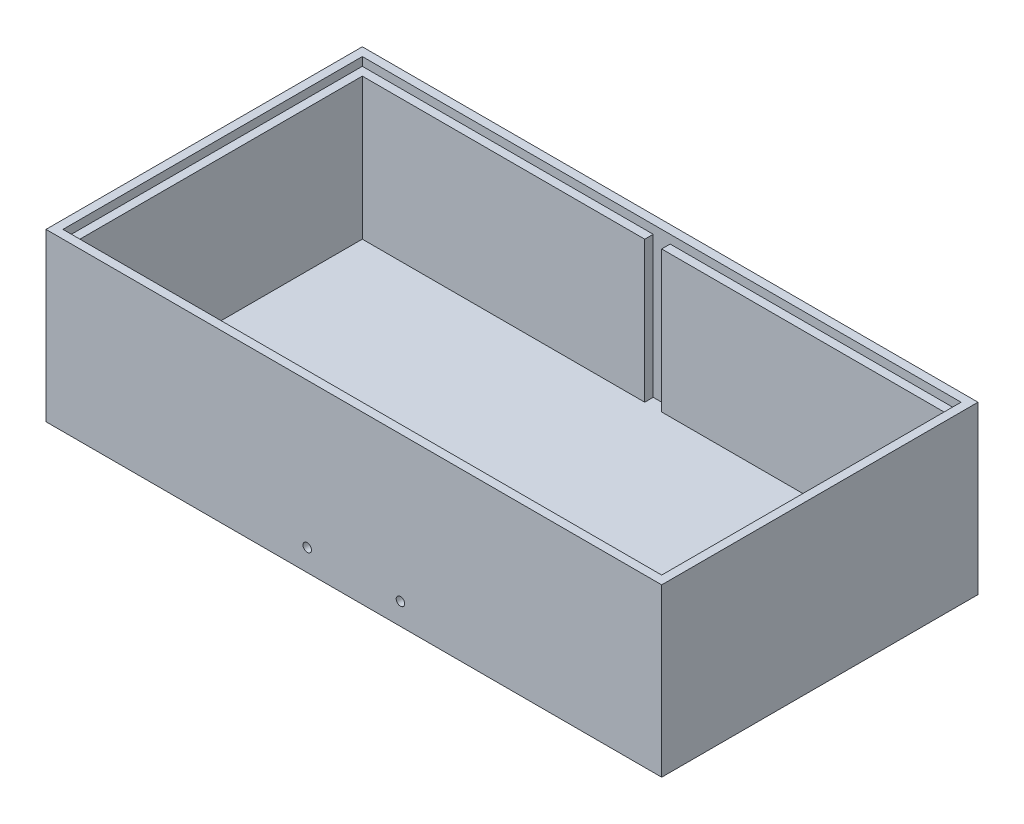
ISO-10303-21;
HEADER;
FILE_DESCRIPTION(('STEP AP214'),'2;1');
FILE_NAME('part.step','',(''),(''),'','','');
FILE_SCHEMA(('AUTOMOTIVE_DESIGN { 1 0 10303 214 1 1 1 1 }'));
ENDSEC;
DATA;
#1=APPLICATION_CONTEXT('core data for automotive mechanical design processes');
#2=APPLICATION_PROTOCOL_DEFINITION('international standard','automotive_design',2000,#1);
#3=PRODUCT_CONTEXT('',#1,'mechanical');
#4=PRODUCT('Part','Part','',(#3));
#5=PRODUCT_RELATED_PRODUCT_CATEGORY('part','',(#4));
#6=PRODUCT_DEFINITION_FORMATION('','',#4);
#7=PRODUCT_DEFINITION_CONTEXT('part definition',#1,'design');
#8=PRODUCT_DEFINITION('design','',#6,#7);
#9=PRODUCT_DEFINITION_SHAPE('','',#8);
#10=(LENGTH_UNIT() NAMED_UNIT(*) SI_UNIT(.MILLI.,.METRE.));
#11=(NAMED_UNIT(*) PLANE_ANGLE_UNIT() SI_UNIT($,.RADIAN.));
#12=(NAMED_UNIT(*) SI_UNIT($,.STERADIAN.) SOLID_ANGLE_UNIT());
#13=UNCERTAINTY_MEASURE_WITH_UNIT(LENGTH_MEASURE(1.E-05),#10,'distance_accuracy_value','');
#14=(GEOMETRIC_REPRESENTATION_CONTEXT(3) GLOBAL_UNCERTAINTY_ASSIGNED_CONTEXT((#13)) GLOBAL_UNIT_ASSIGNED_CONTEXT((#10,
#11,#12)) REPRESENTATION_CONTEXT('',''));
#15=CARTESIAN_POINT('',(0.,0.,0.));
#16=DIRECTION('',(0.,0.,1.));
#17=DIRECTION('',(1.,0.,0.));
#18=AXIS2_PLACEMENT_3D('',#15,#16,#17);
#19=CARTESIAN_POINT('',(3.00000000000001,6.,0.));
#20=DIRECTION('',(-1.,0.,0.));
#21=DIRECTION('',(0.,0.,1.));
#22=AXIS2_PLACEMENT_3D('',#19,#20,#21);
#23=PLANE('',#22);
#24=DIRECTION('',(0.,1.,0.));
#25=VECTOR('',#24,1.);
#26=CARTESIAN_POINT('',(3.00000000000002,6.,-50.));
#27=LINE('',#26,#25);
#28=CARTESIAN_POINT('',(3.00000000000002,6.,-50.));
#29=VERTEX_POINT('',#28);
#30=CARTESIAN_POINT('',(3.00000000000002,56.,-50.));
#31=VERTEX_POINT('',#30);
#32=EDGE_CURVE('E598',#29,#31,#27,.T.);
#33=ORIENTED_EDGE('',*,*,#32,.T.);
#34=DIRECTION('',(0.,0.,1.));
#35=VECTOR('',#34,1.);
#36=CARTESIAN_POINT('',(3.00000000000001,56.,0.));
#37=LINE('',#36,#35);
#38=CARTESIAN_POINT('',(3.00000000000002,56.,-53.));
#39=VERTEX_POINT('',#38);
#40=EDGE_CURVE('E575',#39,#31,#37,.T.);
#41=ORIENTED_EDGE('',*,*,#40,.F.);
#42=DIRECTION('',(0.,1.,0.));
#43=VECTOR('',#42,1.);
#44=CARTESIAN_POINT('',(3.00000000000002,6.,-53.));
#45=LINE('',#44,#43);
#46=CARTESIAN_POINT('',(3.00000000000002,6.,-53.));
#47=VERTEX_POINT('',#46);
#48=EDGE_CURVE('E214',#47,#39,#45,.T.);
#49=ORIENTED_EDGE('',*,*,#48,.F.);
#50=DIRECTION('',(0.,0.,1.));
#51=VECTOR('',#50,1.);
#52=CARTESIAN_POINT('',(3.00000000000001,6.,0.));
#53=LINE('',#52,#51);
#54=EDGE_CURVE('E199',#47,#29,#53,.T.);
#55=ORIENTED_EDGE('',*,*,#54,.T.);
#56=EDGE_LOOP('',(#33,#41,#49,#55));
#57=FACE_BOUND('',#56,.T.);
#58=ADVANCED_FACE('F40',(#57),#23,.T.);
#59=CARTESIAN_POINT('',(0.,6.,-50.));
#60=DIRECTION('',(0.,0.,-1.));
#61=DIRECTION('',(-1.,0.,0.));
#62=AXIS2_PLACEMENT_3D('',#59,#60,#61);
#63=PLANE('',#62);
#64=DIRECTION('',(-1.,0.,0.));
#65=VECTOR('',#64,1.);
#66=CARTESIAN_POINT('',(0.,56.,-50.));
#67=LINE('',#66,#65);
#68=CARTESIAN_POINT('',(103.,56.,-50.));
#69=VERTEX_POINT('',#68);
#70=EDGE_CURVE('E577',#69,#31,#67,.T.);
#71=ORIENTED_EDGE('',*,*,#70,.T.);
#72=ORIENTED_EDGE('',*,*,#32,.F.);
#73=DIRECTION('',(-1.,0.,0.));
#74=VECTOR('',#73,1.);
#75=CARTESIAN_POINT('',(0.,6.,-50.));
#76=LINE('',#75,#74);
#77=CARTESIAN_POINT('',(103.,6.,-50.));
#78=VERTEX_POINT('',#77);
#79=EDGE_CURVE('E203',#78,#29,#76,.T.);
#80=ORIENTED_EDGE('',*,*,#79,.F.);
#81=DIRECTION('',(0.,1.,0.));
#82=VECTOR('',#81,1.);
#83=CARTESIAN_POINT('',(103.,6.,-50.));
#84=LINE('',#83,#82);
#85=EDGE_CURVE('E600',#78,#69,#84,.T.);
#86=ORIENTED_EDGE('',*,*,#85,.T.);
#87=EDGE_LOOP('',(#71,#72,#80,#86));
#88=FACE_BOUND('',#87,.T.);
#89=ADVANCED_FACE('F346',(#88),#63,.F.);
#90=CARTESIAN_POINT('',(103.,6.,0.));
#91=DIRECTION('',(-1.,0.,0.));
#92=DIRECTION('',(0.,0.,1.));
#93=AXIS2_PLACEMENT_3D('',#90,#91,#92);
#94=PLANE('',#93);
#95=DIRECTION('',(0.,1.,0.));
#96=VECTOR('',#95,1.);
#97=CARTESIAN_POINT('',(103.,6.,50.));
#98=LINE('',#97,#96);
#99=CARTESIAN_POINT('',(103.,6.,50.));
#100=VERTEX_POINT('',#99);
#101=CARTESIAN_POINT('',(103.,56.,50.));
#102=VERTEX_POINT('',#101);
#103=EDGE_CURVE('E201',#100,#102,#98,.T.);
#104=ORIENTED_EDGE('',*,*,#103,.T.);
#105=DIRECTION('',(0.,0.,1.));
#106=VECTOR('',#105,1.);
#107=CARTESIAN_POINT('',(103.,56.,0.));
#108=LINE('',#107,#106);
#109=EDGE_CURVE('E580',#69,#102,#108,.T.);
#110=ORIENTED_EDGE('',*,*,#109,.F.);
#111=ORIENTED_EDGE('',*,*,#85,.F.);
#112=DIRECTION('',(0.,0.,1.));
#113=VECTOR('',#112,1.);
#114=CARTESIAN_POINT('',(103.,6.,0.));
#115=LINE('',#114,#113);
#116=EDGE_CURVE('E592',#78,#100,#115,.T.);
#117=ORIENTED_EDGE('',*,*,#116,.T.);
#118=EDGE_LOOP('',(#104,#110,#111,#117));
#119=FACE_BOUND('',#118,.T.);
#120=ADVANCED_FACE('F353',(#119),#94,.T.);
#121=CARTESIAN_POINT('',(0.,6.,50.));
#122=DIRECTION('',(0.,0.,-1.));
#123=DIRECTION('',(-1.,0.,0.));
#124=AXIS2_PLACEMENT_3D('',#121,#122,#123);
#125=PLANE('',#124);
#126=CARTESIAN_POINT('',(16.5,7.7,50.));
#127=DIRECTION('',(0.,0.,-1.));
#128=DIRECTION('',(-1.,0.,0.));
#129=AXIS2_PLACEMENT_3D('',#126,#127,#128);
#130=CIRCLE('',#129,1.5);
#131=CARTESIAN_POINT('',(15.,7.7,50.));
#132=VERTEX_POINT('',#131);
#133=EDGE_CURVE('E565',#132,#132,#130,.T.);
#134=ORIENTED_EDGE('',*,*,#133,.F.);
#135=EDGE_LOOP('',(#134));
#136=FACE_BOUND('',#135,.T.);
#137=DIRECTION('',(0.,1.,0.));
#138=VECTOR('',#137,1.);
#139=CARTESIAN_POINT('',(3.,6.,50.));
#140=LINE('',#139,#138);
#141=CARTESIAN_POINT('',(3.,6.,50.));
#142=VERTEX_POINT('',#141);
#143=CARTESIAN_POINT('',(3.,56.,50.));
#144=VERTEX_POINT('',#143);
#145=EDGE_CURVE('E198',#142,#144,#140,.T.);
#146=ORIENTED_EDGE('',*,*,#145,.T.);
#147=DIRECTION('',(-1.,0.,0.));
#148=VECTOR('',#147,1.);
#149=CARTESIAN_POINT('',(0.,56.,50.));
#150=LINE('',#149,#148);
#151=EDGE_CURVE('E55',#102,#144,#150,.T.);
#152=ORIENTED_EDGE('',*,*,#151,.F.);
#153=ORIENTED_EDGE('',*,*,#103,.F.);
#154=DIRECTION('',(-1.,0.,0.));
#155=VECTOR('',#154,1.);
#156=CARTESIAN_POINT('',(0.,6.,50.));
#157=LINE('',#156,#155);
#158=EDGE_CURVE('E590',#100,#142,#157,.T.);
#159=ORIENTED_EDGE('',*,*,#158,.T.);
#160=EDGE_LOOP('',(#146,#152,#153,#159));
#161=FACE_BOUND('',#160,.T.);
#162=ADVANCED_FACE('F341',(#136,#161),#125,.T.);
#163=CARTESIAN_POINT('',(3.00000000000001,6.,0.));
#164=DIRECTION('',(-1.,0.,0.));
#165=DIRECTION('',(0.,0.,1.));
#166=AXIS2_PLACEMENT_3D('',#163,#164,#165);
#167=PLANE('',#166);
#168=DIRECTION('',(0.,1.,0.));
#169=VECTOR('',#168,1.);
#170=CARTESIAN_POINT('',(3.,6.,53.));
#171=LINE('',#170,#169);
#172=CARTESIAN_POINT('',(3.,6.,53.));
#173=VERTEX_POINT('',#172);
#174=CARTESIAN_POINT('',(3.,56.,53.));
#175=VERTEX_POINT('',#174);
#176=EDGE_CURVE('E188',#173,#175,#171,.T.);
#177=ORIENTED_EDGE('',*,*,#176,.T.);
#178=DIRECTION('',(0.,0.,-1.));
#179=VECTOR('',#178,1.);
#180=CARTESIAN_POINT('',(3.00000000000001,56.,0.));
#181=LINE('',#180,#179);
#182=EDGE_CURVE('E11',#175,#144,#181,.T.);
#183=ORIENTED_EDGE('',*,*,#182,.T.);
#184=ORIENTED_EDGE('',*,*,#145,.F.);
#185=DIRECTION('',(0.,0.,1.));
#186=VECTOR('',#185,1.);
#187=CARTESIAN_POINT('',(3.00000000000001,6.,0.));
#188=LINE('',#187,#186);
#189=EDGE_CURVE('E197',#142,#173,#188,.T.);
#190=ORIENTED_EDGE('',*,*,#189,.T.);
#191=EDGE_LOOP('',(#177,#183,#184,#190));
#192=FACE_BOUND('',#191,.T.);
#193=ADVANCED_FACE('F195',(#192),#167,.T.);
#194=CARTESIAN_POINT('',(0.,59.,0.));
#195=DIRECTION('',(0.,1.,0.));
#196=DIRECTION('',(0.,0.,1.));
#197=AXIS2_PLACEMENT_3D('',#194,#195,#196);
#198=PLANE('',#197);
#199=DIRECTION('',(1.,0.,0.));
#200=VECTOR('',#199,1.);
#201=CARTESIAN_POINT('',(0.,59.,-53.));
#202=LINE('',#201,#200);
#203=CARTESIAN_POINT('',(-106.,59.,-53.));
#204=VERTEX_POINT('',#203);
#205=CARTESIAN_POINT('',(106.,59.,-53.));
#206=VERTEX_POINT('',#205);
#207=EDGE_CURVE('E257',#204,#206,#202,.T.);
#208=ORIENTED_EDGE('',*,*,#207,.T.);
#209=DIRECTION('',(0.,0.,1.));
#210=VECTOR('',#209,1.);
#211=CARTESIAN_POINT('',(106.,59.,0.));
#212=LINE('',#211,#210);
#213=CARTESIAN_POINT('',(106.,59.,53.));
#214=VERTEX_POINT('',#213);
#215=EDGE_CURVE('E192',#206,#214,#212,.T.);
#216=ORIENTED_EDGE('',*,*,#215,.T.);
#217=DIRECTION('',(1.,0.,0.));
#218=VECTOR('',#217,1.);
#219=CARTESIAN_POINT('',(0.,59.,53.));
#220=LINE('',#219,#218);
#221=CARTESIAN_POINT('',(-106.,59.,53.));
#222=VERTEX_POINT('',#221);
#223=EDGE_CURVE('E251',#222,#214,#220,.T.);
#224=ORIENTED_EDGE('',*,*,#223,.F.);
#225=DIRECTION('',(0.,0.,1.));
#226=VECTOR('',#225,1.);
#227=CARTESIAN_POINT('',(-106.,59.,0.));
#228=LINE('',#227,#226);
#229=EDGE_CURVE('E224',#204,#222,#228,.T.);
#230=ORIENTED_EDGE('',*,*,#229,.F.);
#231=EDGE_LOOP('',(#208,#216,#224,#230));
#232=FACE_BOUND('',#231,.T.);
#233=DIRECTION('',(-1.,0.,0.));
#234=VECTOR('',#233,1.);
#235=CARTESIAN_POINT('',(0.,59.,56.));
#236=LINE('',#235,#234);
#237=CARTESIAN_POINT('',(109.,59.,56.));
#238=VERTEX_POINT('',#237);
#239=CARTESIAN_POINT('',(-109.,59.,56.));
#240=VERTEX_POINT('',#239);
#241=EDGE_CURVE('E300',#238,#240,#236,.T.);
#242=ORIENTED_EDGE('',*,*,#241,.F.);
#243=DIRECTION('',(0.,0.,-1.));
#244=VECTOR('',#243,1.);
#245=CARTESIAN_POINT('',(109.,59.,56.));
#246=LINE('',#245,#244);
#247=CARTESIAN_POINT('',(109.,59.,-56.));
#248=VERTEX_POINT('',#247);
#249=EDGE_CURVE('E207',#238,#248,#246,.T.);
#250=ORIENTED_EDGE('',*,*,#249,.T.);
#251=DIRECTION('',(-1.,0.,0.));
#252=VECTOR('',#251,1.);
#253=CARTESIAN_POINT('',(0.,59.,-56.));
#254=LINE('',#253,#252);
#255=CARTESIAN_POINT('',(-109.,59.,-56.));
#256=VERTEX_POINT('',#255);
#257=EDGE_CURVE('E294',#248,#256,#254,.T.);
#258=ORIENTED_EDGE('',*,*,#257,.T.);
#259=DIRECTION('',(0.,0.,-1.));
#260=VECTOR('',#259,1.);
#261=CARTESIAN_POINT('',(-109.,59.,56.));
#262=LINE('',#261,#260);
#263=EDGE_CURVE('E296',#240,#256,#262,.T.);
#264=ORIENTED_EDGE('',*,*,#263,.F.);
#265=EDGE_LOOP('',(#242,#250,#258,#264));
#266=FACE_BOUND('',#265,.T.);
#267=ADVANCED_FACE('F328',(#232,#266),#198,.T.);
#268=CARTESIAN_POINT('',(-3.00000000000001,6.,0.));
#269=DIRECTION('',(-1.,0.,0.));
#270=DIRECTION('',(0.,0.,1.));
#271=AXIS2_PLACEMENT_3D('',#268,#269,#270);
#272=PLANE('',#271);
#273=DIRECTION('',(0.,0.,1.));
#274=VECTOR('',#273,1.);
#275=CARTESIAN_POINT('',(-3.00000000000001,56.,0.));
#276=LINE('',#275,#274);
#277=CARTESIAN_POINT('',(-3.,56.,50.));
#278=VERTEX_POINT('',#277);
#279=CARTESIAN_POINT('',(-3.,56.,53.));
#280=VERTEX_POINT('',#279);
#281=EDGE_CURVE('E242',#278,#280,#276,.T.);
#282=ORIENTED_EDGE('',*,*,#281,.T.);
#283=DIRECTION('',(0.,1.,0.));
#284=VECTOR('',#283,1.);
#285=CARTESIAN_POINT('',(-3.,6.,53.));
#286=LINE('',#285,#284);
#287=CARTESIAN_POINT('',(-3.,6.,53.));
#288=VERTEX_POINT('',#287);
#289=EDGE_CURVE('E276',#288,#280,#286,.T.);
#290=ORIENTED_EDGE('',*,*,#289,.F.);
#291=DIRECTION('',(0.,0.,1.));
#292=VECTOR('',#291,1.);
#293=CARTESIAN_POINT('',(-3.00000000000001,6.,0.));
#294=LINE('',#293,#292);
#295=CARTESIAN_POINT('',(-3.,6.,50.));
#296=VERTEX_POINT('',#295);
#297=EDGE_CURVE('E270',#296,#288,#294,.T.);
#298=ORIENTED_EDGE('',*,*,#297,.F.);
#299=DIRECTION('',(0.,1.,0.));
#300=VECTOR('',#299,1.);
#301=CARTESIAN_POINT('',(-3.,6.,50.));
#302=LINE('',#301,#300);
#303=EDGE_CURVE('E280',#296,#278,#302,.T.);
#304=ORIENTED_EDGE('',*,*,#303,.T.);
#305=EDGE_LOOP('',(#282,#290,#298,#304));
#306=FACE_BOUND('',#305,.T.);
#307=ADVANCED_FACE('F330',(#306),#272,.F.);
#308=CARTESIAN_POINT('',(0.,6.,50.));
#309=DIRECTION('',(0.,0.,1.));
#310=DIRECTION('',(1.,0.,0.));
#311=AXIS2_PLACEMENT_3D('',#308,#309,#310);
#312=PLANE('',#311);
#313=CARTESIAN_POINT('',(-16.5,7.7,50.));
#314=DIRECTION('',(0.,0.,1.));
#315=DIRECTION('',(1.,0.,0.));
#316=AXIS2_PLACEMENT_3D('',#313,#314,#315);
#317=CIRCLE('',#316,1.5);
#318=CARTESIAN_POINT('',(-15.,7.7,50.));
#319=VERTEX_POINT('',#318);
#320=EDGE_CURVE('E221',#319,#319,#317,.T.);
#321=ORIENTED_EDGE('',*,*,#320,.T.);
#322=EDGE_LOOP('',(#321));
#323=FACE_BOUND('',#322,.T.);
#324=DIRECTION('',(1.,0.,0.));
#325=VECTOR('',#324,1.);
#326=CARTESIAN_POINT('',(0.,56.,50.));
#327=LINE('',#326,#325);
#328=CARTESIAN_POINT('',(-103.,56.,50.));
#329=VERTEX_POINT('',#328);
#330=EDGE_CURVE('E227',#329,#278,#327,.T.);
#331=ORIENTED_EDGE('',*,*,#330,.T.);
#332=ORIENTED_EDGE('',*,*,#303,.F.);
#333=DIRECTION('',(1.,0.,0.));
#334=VECTOR('',#333,1.);
#335=CARTESIAN_POINT('',(0.,6.,50.));
#336=LINE('',#335,#334);
#337=CARTESIAN_POINT('',(-103.,6.,50.));
#338=VERTEX_POINT('',#337);
#339=EDGE_CURVE('E267',#338,#296,#336,.T.);
#340=ORIENTED_EDGE('',*,*,#339,.F.);
#341=DIRECTION('',(0.,1.,0.));
#342=VECTOR('',#341,1.);
#343=CARTESIAN_POINT('',(-103.,6.,50.));
#344=LINE('',#343,#342);
#345=EDGE_CURVE('E283',#338,#329,#344,.T.);
#346=ORIENTED_EDGE('',*,*,#345,.T.);
#347=EDGE_LOOP('',(#331,#332,#340,#346));
#348=FACE_BOUND('',#347,.T.);
#349=ADVANCED_FACE('F338',(#323,#348),#312,.F.);
#350=CARTESIAN_POINT('',(-103.,6.,0.));
#351=DIRECTION('',(-1.,0.,0.));
#352=DIRECTION('',(0.,0.,1.));
#353=AXIS2_PLACEMENT_3D('',#350,#351,#352);
#354=PLANE('',#353);
#355=DIRECTION('',(0.,0.,1.));
#356=VECTOR('',#355,1.);
#357=CARTESIAN_POINT('',(-103.,56.,0.));
#358=LINE('',#357,#356);
#359=CARTESIAN_POINT('',(-103.,56.,-50.));
#360=VERTEX_POINT('',#359);
#361=EDGE_CURVE('E229',#360,#329,#358,.T.);
#362=ORIENTED_EDGE('',*,*,#361,.T.);
#363=ORIENTED_EDGE('',*,*,#345,.F.);
#364=DIRECTION('',(0.,0.,1.));
#365=VECTOR('',#364,1.);
#366=CARTESIAN_POINT('',(-103.,6.,0.));
#367=LINE('',#366,#365);
#368=CARTESIAN_POINT('',(-103.,6.,-50.));
#369=VERTEX_POINT('',#368);
#370=EDGE_CURVE('E264',#369,#338,#367,.T.);
#371=ORIENTED_EDGE('',*,*,#370,.F.);
#372=DIRECTION('',(0.,1.,0.));
#373=VECTOR('',#372,1.);
#374=CARTESIAN_POINT('',(-103.,6.,-50.));
#375=LINE('',#374,#373);
#376=EDGE_CURVE('E286',#369,#360,#375,.T.);
#377=ORIENTED_EDGE('',*,*,#376,.T.);
#378=EDGE_LOOP('',(#362,#363,#371,#377));
#379=FACE_BOUND('',#378,.T.);
#380=ADVANCED_FACE('F386',(#379),#354,.F.);
#381=CARTESIAN_POINT('',(0.,6.,-50.));
#382=DIRECTION('',(0.,0.,1.));
#383=DIRECTION('',(1.,0.,0.));
#384=AXIS2_PLACEMENT_3D('',#381,#382,#383);
#385=PLANE('',#384);
#386=DIRECTION('',(0.,1.,0.));
#387=VECTOR('',#386,1.);
#388=CARTESIAN_POINT('',(-3.00000000000002,6.,-50.));
#389=LINE('',#388,#387);
#390=CARTESIAN_POINT('',(-3.00000000000002,6.,-50.));
#391=VERTEX_POINT('',#390);
#392=CARTESIAN_POINT('',(-3.00000000000002,56.,-50.));
#393=VERTEX_POINT('',#392);
#394=EDGE_CURVE('E289',#391,#393,#389,.T.);
#395=ORIENTED_EDGE('',*,*,#394,.T.);
#396=DIRECTION('',(1.,0.,0.));
#397=VECTOR('',#396,1.);
#398=CARTESIAN_POINT('',(0.,56.,-50.));
#399=LINE('',#398,#397);
#400=EDGE_CURVE('E232',#360,#393,#399,.T.);
#401=ORIENTED_EDGE('',*,*,#400,.F.);
#402=ORIENTED_EDGE('',*,*,#376,.F.);
#403=DIRECTION('',(1.,0.,0.));
#404=VECTOR('',#403,1.);
#405=CARTESIAN_POINT('',(0.,6.,-50.));
#406=LINE('',#405,#404);
#407=EDGE_CURVE('E262',#369,#391,#406,.T.);
#408=ORIENTED_EDGE('',*,*,#407,.T.);
#409=EDGE_LOOP('',(#395,#401,#402,#408));
#410=FACE_BOUND('',#409,.T.);
#411=ADVANCED_FACE('F390',(#410),#385,.T.);
#412=CARTESIAN_POINT('',(-3.00000000000001,6.,0.));
#413=DIRECTION('',(-1.,0.,0.));
#414=DIRECTION('',(0.,0.,1.));
#415=AXIS2_PLACEMENT_3D('',#412,#413,#414);
#416=PLANE('',#415);
#417=DIRECTION('',(0.,0.,1.));
#418=VECTOR('',#417,1.);
#419=CARTESIAN_POINT('',(-3.00000000000001,56.,0.));
#420=LINE('',#419,#418);
#421=CARTESIAN_POINT('',(-3.00000000000002,56.,-53.));
#422=VERTEX_POINT('',#421);
#423=EDGE_CURVE('E62',#422,#393,#420,.T.);
#424=ORIENTED_EDGE('',*,*,#423,.T.);
#425=ORIENTED_EDGE('',*,*,#394,.F.);
#426=DIRECTION('',(0.,0.,1.));
#427=VECTOR('',#426,1.);
#428=CARTESIAN_POINT('',(-3.00000000000001,6.,0.));
#429=LINE('',#428,#427);
#430=CARTESIAN_POINT('',(-3.00000000000002,6.,-53.));
#431=VERTEX_POINT('',#430);
#432=EDGE_CURVE('E259',#431,#391,#429,.T.);
#433=ORIENTED_EDGE('',*,*,#432,.F.);
#434=DIRECTION('',(0.,1.,0.));
#435=VECTOR('',#434,1.);
#436=CARTESIAN_POINT('',(-3.00000000000002,6.,-53.));
#437=LINE('',#436,#435);
#438=EDGE_CURVE('E273',#431,#422,#437,.T.);
#439=ORIENTED_EDGE('',*,*,#438,.T.);
#440=EDGE_LOOP('',(#424,#425,#433,#439));
#441=FACE_BOUND('',#440,.T.);
#442=ADVANCED_FACE('F394',(#441),#416,.F.);
#443=CARTESIAN_POINT('',(0.,59.,-56.));
#444=DIRECTION('',(0.,0.,1.));
#445=DIRECTION('',(1.,0.,0.));
#446=AXIS2_PLACEMENT_3D('',#443,#444,#445);
#447=PLANE('',#446);
#448=DIRECTION('',(-1.,0.,0.));
#449=VECTOR('',#448,1.);
#450=CARTESIAN_POINT('',(0.,0.,-56.));
#451=LINE('',#450,#449);
#452=CARTESIAN_POINT('',(109.,0.,-56.));
#453=VERTEX_POINT('',#452);
#454=CARTESIAN_POINT('',(-109.,0.,-56.));
#455=VERTEX_POINT('',#454);
#456=EDGE_CURVE('E279',#453,#455,#451,.T.);
#457=ORIENTED_EDGE('',*,*,#456,.T.);
#458=DIRECTION('',(0.,-1.,0.));
#459=VECTOR('',#458,1.);
#460=CARTESIAN_POINT('',(-109.,59.,-56.));
#461=LINE('',#460,#459);
#462=EDGE_CURVE('E48',#256,#455,#461,.T.);
#463=ORIENTED_EDGE('',*,*,#462,.F.);
#464=ORIENTED_EDGE('',*,*,#257,.F.);
#465=DIRECTION('',(0.,-1.,0.));
#466=VECTOR('',#465,1.);
#467=CARTESIAN_POINT('',(109.,59.,-56.));
#468=LINE('',#467,#466);
#469=EDGE_CURVE('E210',#248,#453,#468,.T.);
#470=ORIENTED_EDGE('',*,*,#469,.T.);
#471=EDGE_LOOP('',(#457,#463,#464,#470));
#472=FACE_BOUND('',#471,.T.);
#473=ADVANCED_FACE('F42',(#472),#447,.F.);
#474=CARTESIAN_POINT('',(-109.,59.,56.));
#475=DIRECTION('',(-1.,0.,0.));
#476=DIRECTION('',(0.,0.,1.));
#477=AXIS2_PLACEMENT_3D('',#474,#475,#476);
#478=PLANE('',#477);
#479=DIRECTION('',(0.,0.,-1.));
#480=VECTOR('',#479,1.);
#481=CARTESIAN_POINT('',(-109.,0.,56.));
#482=LINE('',#481,#480);
#483=CARTESIAN_POINT('',(-109.,0.,56.));
#484=VERTEX_POINT('',#483);
#485=EDGE_CURVE('E306',#484,#455,#482,.T.);
#486=ORIENTED_EDGE('',*,*,#485,.F.);
#487=DIRECTION('',(0.,-1.,0.));
#488=VECTOR('',#487,1.);
#489=CARTESIAN_POINT('',(-109.,59.,56.));
#490=LINE('',#489,#488);
#491=EDGE_CURVE('E303',#240,#484,#490,.T.);
#492=ORIENTED_EDGE('',*,*,#491,.F.);
#493=ORIENTED_EDGE('',*,*,#263,.T.);
#494=ORIENTED_EDGE('',*,*,#462,.T.);
#495=EDGE_LOOP('',(#486,#492,#493,#494));
#496=FACE_BOUND('',#495,.T.);
#497=ADVANCED_FACE('F314',(#496),#478,.T.);
#498=CARTESIAN_POINT('',(0.,59.,56.));
#499=DIRECTION('',(0.,0.,1.));
#500=DIRECTION('',(1.,0.,0.));
#501=AXIS2_PLACEMENT_3D('',#498,#499,#500);
#502=PLANE('',#501);
#503=CARTESIAN_POINT('',(16.5,7.7,56.));
#504=DIRECTION('',(0.,0.,-1.));
#505=DIRECTION('',(-1.,0.,0.));
#506=AXIS2_PLACEMENT_3D('',#503,#504,#505);
#507=CIRCLE('',#506,1.5);
#508=CARTESIAN_POINT('',(15.,7.7,56.));
#509=VERTEX_POINT('',#508);
#510=EDGE_CURVE('E568',#509,#509,#507,.T.);
#511=ORIENTED_EDGE('',*,*,#510,.T.);
#512=EDGE_LOOP('',(#511));
#513=FACE_BOUND('',#512,.T.);
#514=CARTESIAN_POINT('',(-16.5,7.7,56.));
#515=DIRECTION('',(0.,0.,1.));
#516=DIRECTION('',(1.,0.,0.));
#517=AXIS2_PLACEMENT_3D('',#514,#515,#516);
#518=CIRCLE('',#517,1.5);
#519=CARTESIAN_POINT('',(-15.,7.7,56.));
#520=VERTEX_POINT('',#519);
#521=EDGE_CURVE('E220',#520,#520,#518,.T.);
#522=ORIENTED_EDGE('',*,*,#521,.F.);
#523=EDGE_LOOP('',(#522));
#524=FACE_BOUND('',#523,.T.);
#525=DIRECTION('',(-1.,0.,0.));
#526=VECTOR('',#525,1.);
#527=CARTESIAN_POINT('',(0.,0.,56.));
#528=LINE('',#527,#526);
#529=CARTESIAN_POINT('',(109.,0.,56.));
#530=VERTEX_POINT('',#529);
#531=EDGE_CURVE('E297',#530,#484,#528,.T.);
#532=ORIENTED_EDGE('',*,*,#531,.F.);
#533=DIRECTION('',(0.,-1.,0.));
#534=VECTOR('',#533,1.);
#535=CARTESIAN_POINT('',(109.,59.,56.));
#536=LINE('',#535,#534);
#537=EDGE_CURVE('E217',#238,#530,#536,.T.);
#538=ORIENTED_EDGE('',*,*,#537,.F.);
#539=ORIENTED_EDGE('',*,*,#241,.T.);
#540=ORIENTED_EDGE('',*,*,#491,.T.);
#541=EDGE_LOOP('',(#532,#538,#539,#540));
#542=FACE_BOUND('',#541,.T.);
#543=ADVANCED_FACE('F323',(#513,#524,#542),#502,.T.);
#544=CARTESIAN_POINT('',(0.,0.,0.));
#545=DIRECTION('',(0.,1.,0.));
#546=DIRECTION('',(0.,0.,1.));
#547=AXIS2_PLACEMENT_3D('',#544,#545,#546);
#548=PLANE('',#547);
#549=ORIENTED_EDGE('',*,*,#456,.F.);
#550=DIRECTION('',(0.,0.,-1.));
#551=VECTOR('',#550,1.);
#552=CARTESIAN_POINT('',(109.,0.,56.));
#553=LINE('',#552,#551);
#554=EDGE_CURVE('E211',#530,#453,#553,.T.);
#555=ORIENTED_EDGE('',*,*,#554,.F.);
#556=ORIENTED_EDGE('',*,*,#531,.T.);
#557=ORIENTED_EDGE('',*,*,#485,.T.);
#558=EDGE_LOOP('',(#549,#555,#556,#557));
#559=FACE_BOUND('',#558,.T.);
#560=ADVANCED_FACE('F320',(#559),#548,.F.);
#561=CARTESIAN_POINT('',(0.,6.,53.));
#562=DIRECTION('',(0.,0.,1.));
#563=DIRECTION('',(1.,0.,0.));
#564=AXIS2_PLACEMENT_3D('',#561,#562,#563);
#565=PLANE('',#564);
#566=ORIENTED_EDGE('',*,*,#223,.T.);
#567=DIRECTION('',(0.,1.,0.));
#568=VECTOR('',#567,1.);
#569=CARTESIAN_POINT('',(106.,56.,53.));
#570=LINE('',#569,#568);
#571=CARTESIAN_POINT('',(106.,56.,53.));
#572=VERTEX_POINT('',#571);
#573=EDGE_CURVE('E190',#572,#214,#570,.T.);
#574=ORIENTED_EDGE('',*,*,#573,.F.);
#575=DIRECTION('',(-1.,0.,0.));
#576=VECTOR('',#575,1.);
#577=CARTESIAN_POINT('',(0.,56.,53.));
#578=LINE('',#577,#576);
#579=EDGE_CURVE('E178',#572,#175,#578,.T.);
#580=ORIENTED_EDGE('',*,*,#579,.T.);
#581=ORIENTED_EDGE('',*,*,#176,.F.);
#582=DIRECTION('',(1.,0.,0.));
#583=VECTOR('',#582,1.);
#584=CARTESIAN_POINT('',(0.,6.,53.));
#585=LINE('',#584,#583);
#586=EDGE_CURVE('E254',#288,#173,#585,.T.);
#587=ORIENTED_EDGE('',*,*,#586,.F.);
#588=ORIENTED_EDGE('',*,*,#289,.T.);
#589=DIRECTION('',(1.,0.,0.));
#590=VECTOR('',#589,1.);
#591=CARTESIAN_POINT('',(0.,56.,53.));
#592=LINE('',#591,#590);
#593=CARTESIAN_POINT('',(-106.,56.,53.));
#594=VERTEX_POINT('',#593);
#595=EDGE_CURVE('E240',#594,#280,#592,.T.);
#596=ORIENTED_EDGE('',*,*,#595,.F.);
#597=DIRECTION('',(0.,1.,0.));
#598=VECTOR('',#597,1.);
#599=CARTESIAN_POINT('',(-106.,56.,53.));
#600=LINE('',#599,#598);
#601=EDGE_CURVE('E248',#594,#222,#600,.T.);
#602=ORIENTED_EDGE('',*,*,#601,.T.);
#603=EDGE_LOOP('',(#566,#574,#580,#581,#587,#588,#596,#602));
#604=FACE_BOUND('',#603,.T.);
#605=ADVANCED_FACE('F186',(#604),#565,.F.);
#606=CARTESIAN_POINT('',(0.,6.,-53.));
#607=DIRECTION('',(0.,0.,1.));
#608=DIRECTION('',(1.,0.,0.));
#609=AXIS2_PLACEMENT_3D('',#606,#607,#608);
#610=PLANE('',#609);
#611=ORIENTED_EDGE('',*,*,#207,.F.);
#612=DIRECTION('',(0.,1.,0.));
#613=VECTOR('',#612,1.);
#614=CARTESIAN_POINT('',(-106.,56.,-53.));
#615=LINE('',#614,#613);
#616=CARTESIAN_POINT('',(-106.,56.,-53.));
#617=VERTEX_POINT('',#616);
#618=EDGE_CURVE('E245',#617,#204,#615,.T.);
#619=ORIENTED_EDGE('',*,*,#618,.F.);
#620=DIRECTION('',(1.,0.,0.));
#621=VECTOR('',#620,1.);
#622=CARTESIAN_POINT('',(0.,56.,-53.));
#623=LINE('',#622,#621);
#624=EDGE_CURVE('E235',#617,#422,#623,.T.);
#625=ORIENTED_EDGE('',*,*,#624,.T.);
#626=ORIENTED_EDGE('',*,*,#438,.F.);
#627=DIRECTION('',(1.,0.,0.));
#628=VECTOR('',#627,1.);
#629=CARTESIAN_POINT('',(0.,6.,-53.));
#630=LINE('',#629,#628);
#631=EDGE_CURVE('E256',#431,#47,#630,.T.);
#632=ORIENTED_EDGE('',*,*,#631,.T.);
#633=ORIENTED_EDGE('',*,*,#48,.T.);
#634=DIRECTION('',(-1.,0.,0.));
#635=VECTOR('',#634,1.);
#636=CARTESIAN_POINT('',(0.,56.,-53.));
#637=LINE('',#636,#635);
#638=CARTESIAN_POINT('',(106.,56.,-53.));
#639=VERTEX_POINT('',#638);
#640=EDGE_CURVE('E573',#639,#39,#637,.T.);
#641=ORIENTED_EDGE('',*,*,#640,.F.);
#642=DIRECTION('',(0.,1.,0.));
#643=VECTOR('',#642,1.);
#644=CARTESIAN_POINT('',(106.,56.,-53.));
#645=LINE('',#644,#643);
#646=EDGE_CURVE('E585',#639,#206,#645,.T.);
#647=ORIENTED_EDGE('',*,*,#646,.T.);
#648=EDGE_LOOP('',(#611,#619,#625,#626,#632,#633,#641,#647));
#649=FACE_BOUND('',#648,.T.);
#650=ADVANCED_FACE('F381',(#649),#610,.T.);
#651=CARTESIAN_POINT('',(0.,6.,0.));
#652=DIRECTION('',(0.,1.,0.));
#653=DIRECTION('',(0.,0.,1.));
#654=AXIS2_PLACEMENT_3D('',#651,#652,#653);
#655=PLANE('',#654);
#656=ORIENTED_EDGE('',*,*,#586,.T.);
#657=ORIENTED_EDGE('',*,*,#189,.F.);
#658=ORIENTED_EDGE('',*,*,#158,.F.);
#659=ORIENTED_EDGE('',*,*,#116,.F.);
#660=ORIENTED_EDGE('',*,*,#79,.T.);
#661=ORIENTED_EDGE('',*,*,#54,.F.);
#662=ORIENTED_EDGE('',*,*,#631,.F.);
#663=ORIENTED_EDGE('',*,*,#432,.T.);
#664=ORIENTED_EDGE('',*,*,#407,.F.);
#665=ORIENTED_EDGE('',*,*,#370,.T.);
#666=ORIENTED_EDGE('',*,*,#339,.T.);
#667=ORIENTED_EDGE('',*,*,#297,.T.);
#668=EDGE_LOOP('',(#656,#657,#658,#659,#660,#661,#662,#663,#664,#665,#666,#667));
#669=FACE_BOUND('',#668,.T.);
#670=ADVANCED_FACE('F376',(#669),#655,.T.);
#671=CARTESIAN_POINT('',(0.,56.,0.));
#672=DIRECTION('',(0.,1.,0.));
#673=DIRECTION('',(0.,0.,1.));
#674=AXIS2_PLACEMENT_3D('',#671,#672,#673);
#675=PLANE('',#674);
#676=ORIENTED_EDGE('',*,*,#281,.F.);
#677=ORIENTED_EDGE('',*,*,#330,.F.);
#678=ORIENTED_EDGE('',*,*,#361,.F.);
#679=ORIENTED_EDGE('',*,*,#400,.T.);
#680=ORIENTED_EDGE('',*,*,#423,.F.);
#681=ORIENTED_EDGE('',*,*,#624,.F.);
#682=DIRECTION('',(0.,0.,1.));
#683=VECTOR('',#682,1.);
#684=CARTESIAN_POINT('',(-106.,56.,0.));
#685=LINE('',#684,#683);
#686=EDGE_CURVE('E237',#617,#594,#685,.T.);
#687=ORIENTED_EDGE('',*,*,#686,.T.);
#688=ORIENTED_EDGE('',*,*,#595,.T.);
#689=EDGE_LOOP('',(#676,#677,#678,#679,#680,#681,#687,#688));
#690=FACE_BOUND('',#689,.T.);
#691=ADVANCED_FACE('F373',(#690),#675,.T.);
#692=CARTESIAN_POINT('',(-106.,56.,0.));
#693=DIRECTION('',(-1.,0.,0.));
#694=DIRECTION('',(0.,0.,1.));
#695=AXIS2_PLACEMENT_3D('',#692,#693,#694);
#696=PLANE('',#695);
#697=ORIENTED_EDGE('',*,*,#229,.T.);
#698=ORIENTED_EDGE('',*,*,#601,.F.);
#699=ORIENTED_EDGE('',*,*,#686,.F.);
#700=ORIENTED_EDGE('',*,*,#618,.T.);
#701=EDGE_LOOP('',(#697,#698,#699,#700));
#702=FACE_BOUND('',#701,.T.);
#703=ADVANCED_FACE('F371',(#702),#696,.F.);
#704=CARTESIAN_POINT('',(-16.5,7.7,50.));
#705=DIRECTION('',(0.,0.,1.));
#706=DIRECTION('',(1.,0.,0.));
#707=AXIS2_PLACEMENT_3D('',#704,#705,#706);
#708=CYLINDRICAL_SURFACE('',#707,1.5);
#709=ORIENTED_EDGE('',*,*,#320,.F.);
#710=EDGE_LOOP('',(#709));
#711=FACE_BOUND('',#710,.T.);
#712=ORIENTED_EDGE('',*,*,#521,.T.);
#713=EDGE_LOOP('',(#712));
#714=FACE_BOUND('',#713,.T.);
#715=ADVANCED_FACE('F369',(#711,#714),#708,.F.);
#716=CARTESIAN_POINT('',(109.,59.,56.));
#717=DIRECTION('',(-1.,0.,0.));
#718=DIRECTION('',(0.,0.,1.));
#719=AXIS2_PLACEMENT_3D('',#716,#717,#718);
#720=PLANE('',#719);
#721=ORIENTED_EDGE('',*,*,#554,.T.);
#722=ORIENTED_EDGE('',*,*,#469,.F.);
#723=ORIENTED_EDGE('',*,*,#249,.F.);
#724=ORIENTED_EDGE('',*,*,#537,.T.);
#725=EDGE_LOOP('',(#721,#722,#723,#724));
#726=FACE_BOUND('',#725,.T.);
#727=ADVANCED_FACE('F326',(#726),#720,.F.);
#728=CARTESIAN_POINT('',(106.,56.,0.));
#729=DIRECTION('',(-1.,0.,0.));
#730=DIRECTION('',(0.,0.,1.));
#731=AXIS2_PLACEMENT_3D('',#728,#729,#730);
#732=PLANE('',#731);
#733=ORIENTED_EDGE('',*,*,#215,.F.);
#734=ORIENTED_EDGE('',*,*,#646,.F.);
#735=DIRECTION('',(0.,0.,1.));
#736=VECTOR('',#735,1.);
#737=CARTESIAN_POINT('',(106.,56.,0.));
#738=LINE('',#737,#736);
#739=EDGE_CURVE('E191',#639,#572,#738,.T.);
#740=ORIENTED_EDGE('',*,*,#739,.T.);
#741=ORIENTED_EDGE('',*,*,#573,.T.);
#742=EDGE_LOOP('',(#733,#734,#740,#741));
#743=FACE_BOUND('',#742,.T.);
#744=ADVANCED_FACE('F358',(#743),#732,.T.);
#745=CARTESIAN_POINT('',(0.,56.,0.));
#746=DIRECTION('',(0.,1.,0.));
#747=DIRECTION('',(0.,0.,1.));
#748=AXIS2_PLACEMENT_3D('',#745,#746,#747);
#749=PLANE('',#748);
#750=ORIENTED_EDGE('',*,*,#182,.F.);
#751=ORIENTED_EDGE('',*,*,#579,.F.);
#752=ORIENTED_EDGE('',*,*,#739,.F.);
#753=ORIENTED_EDGE('',*,*,#640,.T.);
#754=ORIENTED_EDGE('',*,*,#40,.T.);
#755=ORIENTED_EDGE('',*,*,#70,.F.);
#756=ORIENTED_EDGE('',*,*,#109,.T.);
#757=ORIENTED_EDGE('',*,*,#151,.T.);
#758=EDGE_LOOP('',(#750,#751,#752,#753,#754,#755,#756,#757));
#759=FACE_BOUND('',#758,.T.);
#760=ADVANCED_FACE('F176',(#759),#749,.T.);
#761=CARTESIAN_POINT('',(16.5,7.7,50.));
#762=DIRECTION('',(0.,0.,1.));
#763=DIRECTION('',(1.,0.,0.));
#764=AXIS2_PLACEMENT_3D('',#761,#762,#763);
#765=CYLINDRICAL_SURFACE('',#764,1.5);
#766=ORIENTED_EDGE('',*,*,#133,.T.);
#767=EDGE_LOOP('',(#766));
#768=FACE_BOUND('',#767,.T.);
#769=ORIENTED_EDGE('',*,*,#510,.F.);
#770=EDGE_LOOP('',(#769));
#771=FACE_BOUND('',#770,.T.);
#772=ADVANCED_FACE('F531',(#768,#771),#765,.F.);
#773=CLOSED_SHELL('',(#58,#89,#120,#162,#193,#267,#307,#349,#380,#411,#442,#473,#497,#543,#560,
#605,#650,#670,#691,#703,#715,#727,#744,#760,#772));
#774=MANIFOLD_SOLID_BREP('B2',#773);
#775=ADVANCED_BREP_SHAPE_REPRESENTATION('',(#18,#774),#14);
#776=SHAPE_DEFINITION_REPRESENTATION(#9,#775);
ENDSEC;
END-ISO-10303-21;
